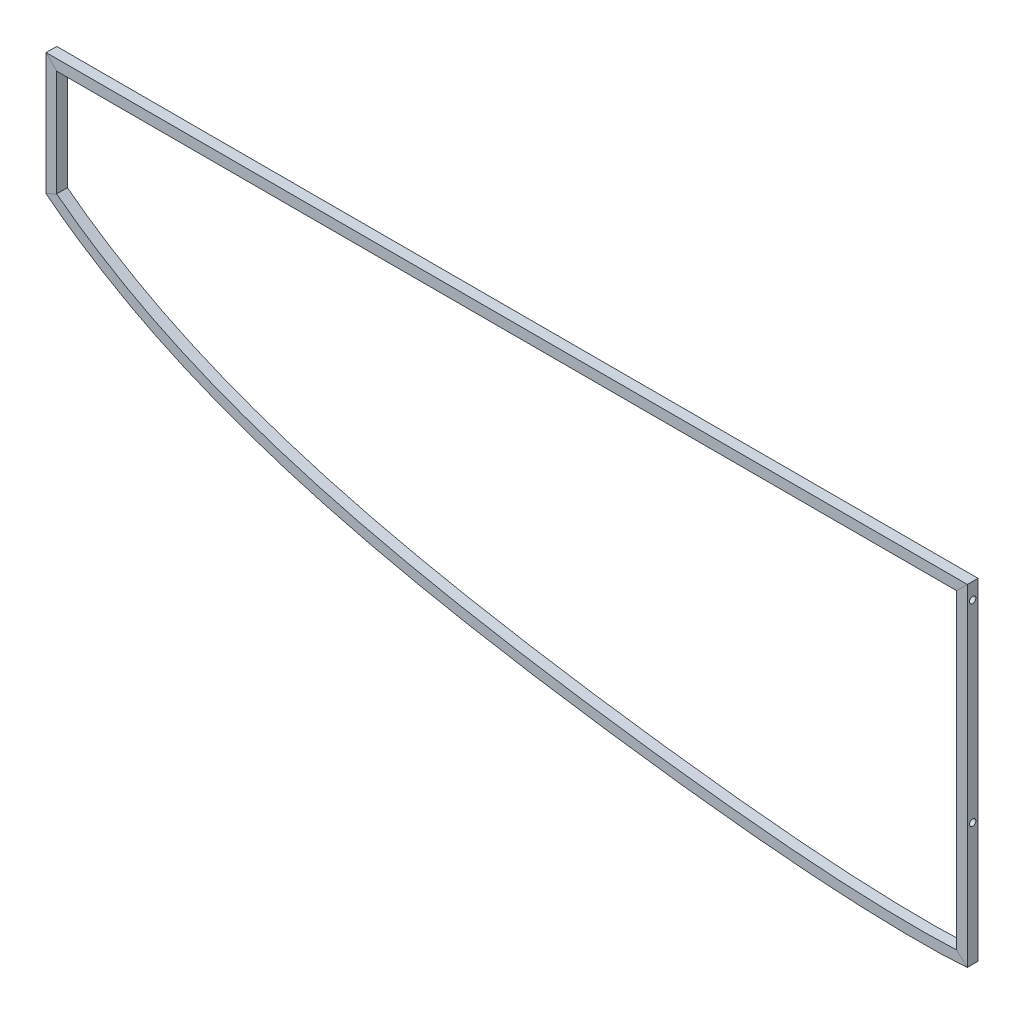
ISO-10303-21;
HEADER;
FILE_DESCRIPTION(('STEP AP214'),'2;1');
FILE_NAME('part.step','',(''),(''),'','','');
FILE_SCHEMA(('AUTOMOTIVE_DESIGN { 1 0 10303 214 1 1 1 1 }'));
ENDSEC;
DATA;
#1=APPLICATION_CONTEXT('core data for automotive mechanical design processes');
#2=APPLICATION_PROTOCOL_DEFINITION('international standard','automotive_design',2000,#1);
#3=PRODUCT_CONTEXT('',#1,'mechanical');
#4=PRODUCT('Part','Part','',(#3));
#5=PRODUCT_RELATED_PRODUCT_CATEGORY('part','',(#4));
#6=PRODUCT_DEFINITION_FORMATION('','',#4);
#7=PRODUCT_DEFINITION_CONTEXT('part definition',#1,'design');
#8=PRODUCT_DEFINITION('design','',#6,#7);
#9=PRODUCT_DEFINITION_SHAPE('','',#8);
#10=(LENGTH_UNIT() NAMED_UNIT(*) SI_UNIT(.MILLI.,.METRE.));
#11=(NAMED_UNIT(*) PLANE_ANGLE_UNIT() SI_UNIT($,.RADIAN.));
#12=(NAMED_UNIT(*) SI_UNIT($,.STERADIAN.) SOLID_ANGLE_UNIT());
#13=UNCERTAINTY_MEASURE_WITH_UNIT(LENGTH_MEASURE(1.E-05),#10,'distance_accuracy_value','');
#14=(GEOMETRIC_REPRESENTATION_CONTEXT(3) GLOBAL_UNCERTAINTY_ASSIGNED_CONTEXT((#13)) GLOBAL_UNIT_ASSIGNED_CONTEXT((#10,
#11,#12)) REPRESENTATION_CONTEXT('',''));
#15=CARTESIAN_POINT('',(0.,0.,0.));
#16=DIRECTION('',(0.,0.,1.));
#17=DIRECTION('',(1.,0.,0.));
#18=AXIS2_PLACEMENT_3D('',#15,#16,#17);
#19=CARTESIAN_POINT('',(43.1608813126704,-14.9890255154885,0.256277747607866));
#20=CARTESIAN_POINT('',(42.1977065370625,-15.0623980776926,0.256277747607866));
#21=CARTESIAN_POINT('',(40.0595586433162,-15.0983926124649,0.256277747607871));
#22=CARTESIAN_POINT('',(34.0554065649618,-14.7316159753437,0.256277747607871));
#23=CARTESIAN_POINT('',(30.1676829484615,-14.3224801673673,0.256277747607875));
#24=CARTESIAN_POINT('',(23.57051146709,-13.3722099659773,0.256277747607875));
#25=CARTESIAN_POINT('',(21.2474352072473,-13.0001626084811,0.256277747607878));
#26=CARTESIAN_POINT('',(16.5103526840526,-12.0800315265816,0.256277747607878));
#27=CARTESIAN_POINT('',(14.0956443202091,-11.529025125158,0.256277747607879));
#28=CARTESIAN_POINT('',(9.41683774067244,-10.1378840036944,0.256277747607879));
#29=CARTESIAN_POINT('',(7.14862853042051,-9.28644070187186,0.256277747607877));
#30=CARTESIAN_POINT('',(3.13241012325134,-7.31991184794454,0.256277747607877));
#31=CARTESIAN_POINT('',(1.38477876132513,-6.18783368503358,0.256277747607872));
#32=CARTESIAN_POINT('',(0.155893204895723,-5.21839039409237,0.256277747607872));
#33=CARTESIAN_POINT('',(43.1605337219629,-14.9844626290768,-0.251701640997907));
#34=CARTESIAN_POINT('',(42.1976896859935,-15.0578099963023,-0.251701640997907));
#35=CARTESIAN_POINT('',(40.0596671625024,-15.0938146047226,-0.251701640997902));
#36=CARTESIAN_POINT('',(34.0558560873831,-14.7270587985566,-0.251701640997902));
#37=CARTESIAN_POINT('',(30.1682343404047,-14.3179362553215,-0.251701640997897));
#38=CARTESIAN_POINT('',(23.5712143987289,-13.3676878820136,-0.251701640997897));
#39=CARTESIAN_POINT('',(21.2482096471728,-12.9956514019503,-0.251701640997895));
#40=CARTESIAN_POINT('',(16.5113233536712,-12.0755584357273,-0.251701640997895));
#41=CARTESIAN_POINT('',(14.0967511977093,-11.5245801343141,-0.251701640997894));
#42=CARTESIAN_POINT('',(9.41833921857712,-10.1335563387885,-0.251701640997894));
#43=CARTESIAN_POINT('',(7.15034669490692,-9.28218676425492,-0.251701640997896));
#44=CARTESIAN_POINT('',(3.13471672735123,-7.31594603832389,-0.251701640997896));
#45=CARTESIAN_POINT('',(1.38733208165102,-6.18401932551314,-0.2517016409979));
#46=CARTESIAN_POINT('',(0.15872744913245,-5.21479764983312,-0.2517016409979));
#47=B_SPLINE_SURFACE_WITH_KNOTS('',1,3,((#19,#20,#21,#22,#23,#24,#25,#26,#27,#28,#29,#30,#31,
#32),(#33,#34,#35,#36,#37,#38,#39,#40,#41,#42,#43,#44,#45,#46)),.UNSPECIFIED.,.F.,.F.,.F.,(2,2),
(4,2,2,2,2,2,4),(0.,1.),(0.,0.25,0.5,0.625,0.75,0.875,1.),.UNSPECIFIED.);
#48=CARTESIAN_POINT('',(0.251701641165775,-5.29348092747873,0.25627774760636));
#49=CARTESIAN_POINT('',(0.252082983291486,-5.29329455652352,0.213946131829942));
#50=CARTESIAN_POINT('',(0.252464325459027,-5.29310818227002,0.171614516068421));
#51=CARTESIAN_POINT('',(0.25341768094049,-5.29264223832548,0.0657854767017709));
#52=CARTESIAN_POINT('',(0.253989694285719,-5.29236266447903,0.00228805311521854));
#53=CARTESIAN_POINT('',(0.255133720975575,-5.29180350165099,-0.124706793991254));
#54=CARTESIAN_POINT('',(0.255705734320203,-5.2915239126694,-0.188204217511175));
#55=CARTESIAN_POINT('',(0.25627774760788,-5.29124431603238,-0.2517016409979));
#56=B_SPLINE_CURVE_WITH_KNOTS('',3,(#48,#49,#50,#51,#52,#53,#54,#55),.UNSPECIFIED.,.F.,.F.,(4,2,
2,4),(0.,0.127001230906354,0.317503077265896,0.508004923625448),.UNSPECIFIED.);
#57=CARTESIAN_POINT('',(0.251701887830832,-5.2934834955976,0.25627774760762));
#58=VERTEX_POINT('',#57);
#59=CARTESIAN_POINT('',(0.256278012579946,-5.29124707359022,-0.2517016409979));
#60=VERTEX_POINT('',#59);
#61=EDGE_CURVE('E350',#58,#60,#56,.T.);
#62=CARTESIAN_POINT('',(43.5210850329942,-14.9615859838674,0.256277747607864));
#63=CARTESIAN_POINT('',(43.4019951838441,-14.970657988117,0.256277747607874));
#64=CARTESIAN_POINT('',(43.2796471661761,-14.9799807855851,0.256277747607865));
#65=CARTESIAN_POINT('',(42.1901575661681,-15.0629519332152,0.256277747607865));
#66=CARTESIAN_POINT('',(40.0595586433162,-15.0983926124649,0.25627774760787));
#67=CARTESIAN_POINT('',(34.0554065649618,-14.7316159753437,0.25627774760787));
#68=CARTESIAN_POINT('',(30.1676829484615,-14.3224801673673,0.256277747607875));
#69=CARTESIAN_POINT('',(23.57051146709,-13.3722099659773,0.256277747607875));
#70=CARTESIAN_POINT('',(21.2474352072473,-13.0001626084811,0.256277747607878));
#71=CARTESIAN_POINT('',(16.5103526840526,-12.0800315265816,0.256277747607878));
#72=CARTESIAN_POINT('',(14.0956443202112,-11.529025125158,0.256277747607879));
#73=CARTESIAN_POINT('',(9.41683774067031,-10.1378840036944,0.256277747607879));
#74=CARTESIAN_POINT('',(7.14862853042051,-9.28644070187186,0.256277747607876));
#75=CARTESIAN_POINT('',(3.13241012325134,-7.31991184794454,0.256277747607876));
#76=CARTESIAN_POINT('',(1.39216153825419,-6.19363196719314,0.256277747607872));
#77=CARTESIAN_POINT('',(0.0943560904382608,-5.1698462789612,0.256277747607872));
#78=CARTESIAN_POINT('',(0.0317135701671623,-5.12042755881915,0.256277747607872));
#79=CARTESIAN_POINT('',(-0.0299230622114602,-5.07180364977235,0.256277747607872));
#80=B_SPLINE_CURVE_WITH_KNOTS('',3,(#62,#63,#64,#65,#66,#67,#68,#69,#70,#71,#72,#73,#74,#75,#76,
#77,#78,#79),.UNSPECIFIED.,.F.,.F.,(4,2,2,2,2,2,2,2,4),(-0.0305869342162508,0.,0.25,0.5,0.625,
0.75,0.875,1.,1.00622206288038),.UNSPECIFIED.);
#81=CARTESIAN_POINT('',(42.9282983590021,-15.0046017950914,0.256277747607866));
#82=VERTEX_POINT('',#81);
#83=EDGE_CURVE('E51',#82,#58,#80,.T.);
#84=CARTESIAN_POINT('',(42.9282983590021,-15.0046017950914,0.256277747607867));
#85=CARTESIAN_POINT('',(42.9279170167809,-15.0042422349058,0.213946131483439));
#86=CARTESIAN_POINT('',(42.9275356745607,-15.0038826627125,0.171614515460995));
#87=CARTESIAN_POINT('',(42.9265823190123,-15.002983702246,0.0657854756595083));
#88=CARTESIAN_POINT('',(42.9260103056854,-15.0024442989814,0.00228805200780034));
#89=CARTESIAN_POINT('',(42.9248662790357,-15.0013654385809,-0.124706794838045));
#90=CARTESIAN_POINT('',(42.9242942657129,-15.000825981445,-0.188204218032183));
#91=CARTESIAN_POINT('',(42.9237222523921,-15.0002864974226,-0.251701640997907));
#92=B_SPLINE_CURVE_WITH_KNOTS('',3,(#84,#85,#86,#87,#88,#89,#90,#91),.UNSPECIFIED.,.F.,.F.,(4,2,
2,4),(0.,0.127004582051609,0.317511455129154,0.508018328206837),.UNSPECIFIED.);
#93=CARTESIAN_POINT('',(42.9237219356784,-15.0002973744549,-0.251701640997906));
#94=VERTEX_POINT('',#93);
#95=EDGE_CURVE('E319',#82,#94,#92,.T.);
#96=CARTESIAN_POINT('',(43.5207374422867,-14.9570230974557,-0.251701640997908));
#97=CARTESIAN_POINT('',(43.4016657013447,-14.9660937222616,-0.251701640997898));
#98=CARTESIAN_POINT('',(43.2792754649397,-14.9754197347965,-0.251701640997907));
#99=CARTESIAN_POINT('',(42.1900070410499,-15.058374043476,-0.251701640997907));
#100=CARTESIAN_POINT('',(40.0596671625024,-15.0938146047226,-0.251701640997902));
#101=CARTESIAN_POINT('',(34.0558560873831,-14.7270587985566,-0.251701640997902));
#102=CARTESIAN_POINT('',(30.1682343404047,-14.3179362553176,-0.251701640997897));
#103=CARTESIAN_POINT('',(23.5712143987289,-13.3676878820156,-0.251701640997897));
#104=CARTESIAN_POINT('',(21.2482096471728,-12.9956514019503,-0.251701640997895));
#105=CARTESIAN_POINT('',(16.5113233536712,-12.0755584357273,-0.251701640997895));
#106=CARTESIAN_POINT('',(14.0967511977093,-11.5245801343119,-0.251701640997894));
#107=CARTESIAN_POINT('',(9.41833921857712,-10.1335563387907,-0.251701640997894));
#108=CARTESIAN_POINT('',(7.15034669490692,-9.28218676425492,-0.251701640997896));
#109=CARTESIAN_POINT('',(3.13471672735123,-7.31594603832389,-0.251701640997896));
#110=CARTESIAN_POINT('',(1.39484809642748,-6.18992272256034,-0.2517016409979));
#111=CARTESIAN_POINT('',(0.0971976859707738,-5.16625933368314,-0.2517016409979));
#112=CARTESIAN_POINT('',(0.0345422933091377,-5.11683045907844,-0.2517016409979));
#113=CARTESIAN_POINT('',(-0.0270888179747329,-5.0682109055131,-0.2517016409979));
#114=B_SPLINE_CURVE_WITH_KNOTS('',3,(#96,#97,#98,#99,#100,#101,#102,#103,#104,#105,#106,#107,
#108,#109,#110,#111,#112,#113),.UNSPECIFIED.,.F.,.F.,(4,2,2,2,2,2,2,2,4),(-0.0305869342162508,
0.,0.25,0.5,0.625,0.75,0.875,1.,1.00622206288038),.UNSPECIFIED.);
#115=EDGE_CURVE('E141',#94,#60,#114,.T.);
#116=ORIENTED_EDGE('',*,*,#61,.F.);
#117=ORIENTED_EDGE('',*,*,#83,.F.);
#118=ORIENTED_EDGE('',*,*,#95,.T.);
#119=ORIENTED_EDGE('',*,*,#115,.T.);
#120=EDGE_LOOP('',(#116,#117,#118,#119));
#121=FACE_BOUND('',#120,.T.);
#122=ADVANCED_FACE('F45',(#121),#47,.T.);
#123=CARTESIAN_POINT('',(43.5207374422867,-14.9570230974557,-0.251701640997908));
#124=CARTESIAN_POINT('',(43.4016657013447,-14.9660937222616,-0.251701640997898));
#125=CARTESIAN_POINT('',(43.2792754649397,-14.9754197347965,-0.251701640997907));
#126=CARTESIAN_POINT('',(42.1900070410499,-15.058374043476,-0.251701640997907));
#127=CARTESIAN_POINT('',(40.0596671625024,-15.0938146047226,-0.251701640997902));
#128=CARTESIAN_POINT('',(34.0558560873831,-14.7270587985566,-0.251701640997902));
#129=CARTESIAN_POINT('',(30.1682343404047,-14.3179362553176,-0.251701640997897));
#130=CARTESIAN_POINT('',(23.5712143987289,-13.3676878820156,-0.251701640997897));
#131=CARTESIAN_POINT('',(21.2482096471728,-12.9956514019503,-0.251701640997895));
#132=CARTESIAN_POINT('',(16.5113233536712,-12.0755584357273,-0.251701640997895));
#133=CARTESIAN_POINT('',(14.0967511977093,-11.5245801343119,-0.251701640997894));
#134=CARTESIAN_POINT('',(9.41833921857712,-10.1335563387907,-0.251701640997894));
#135=CARTESIAN_POINT('',(7.15034669490692,-9.28218676425492,-0.251701640997896));
#136=CARTESIAN_POINT('',(3.13471672735123,-7.31594603832389,-0.251701640997896));
#137=CARTESIAN_POINT('',(1.39484809642748,-6.18992272256034,-0.2517016409979));
#138=CARTESIAN_POINT('',(0.0971976859707738,-5.16625933368314,-0.2517016409979));
#139=CARTESIAN_POINT('',(0.0345422933091377,-5.11683045907844,-0.2517016409979));
#140=CARTESIAN_POINT('',(-0.0270888179747329,-5.0682109055131,-0.2517016409979));
#141=CARTESIAN_POINT('',(43.5593224076534,-15.4635349528905,-0.256277747607876));
#142=CARTESIAN_POINT('',(43.4382405307807,-15.4727587054552,-0.256277747607866));
#143=CARTESIAN_POINT('',(43.3205368652361,-15.4817278233993,-0.256277747607875));
#144=CARTESIAN_POINT('',(42.2067163673716,-15.566551371744,-0.256277747607875));
#145=CARTESIAN_POINT('',(40.0476207851262,-15.6020050322157,-0.25627774760787));
#146=CARTESIAN_POINT('',(34.0059559983117,-15.232936846211,-0.25627774760787));
#147=CARTESIAN_POINT('',(30.1070260329861,-14.8223418258869,-0.256277747607866));
#148=CARTESIAN_POINT('',(23.4931841394771,-13.8696703840638,-0.256277747607866));
#149=CARTESIAN_POINT('',(21.1622414751336,-13.496426434318,-0.256277747607863));
#150=CARTESIAN_POINT('',(16.4035723327812,-12.5721023650183,-0.256277747607863));
#151=CARTESIAN_POINT('',(13.9738801626651,-12.0180047689144,-0.256277747607862));
#152=CARTESIAN_POINT('',(9.25166481756314,-10.6139569849501,-0.256277747607862));
#153=CARTESIAN_POINT('',(6.95961858912296,-9.75440317312925,-0.256277747607866));
#154=CARTESIAN_POINT('',(2.87866776695075,-7.75617825272913,-0.256277747607866));
#155=CARTESIAN_POINT('',(1.09662161381993,-6.60167445420979,-0.256277747607872));
#156=CARTESIAN_POINT('',(-0.218239012580985,-5.56443499360627,-0.256277747607872));
#157=CARTESIAN_POINT('',(-0.279465481129904,-5.51613333437817,-0.256277747607872));
#158=CARTESIAN_POINT('',(-0.341709472002886,-5.46703029233775,-0.256277747607872));
#159=B_SPLINE_SURFACE_WITH_KNOTS('',1,3,((#123,#124,#125,#126,#127,#128,#129,#130,#131,#132,
#133,#134,#135,#136,#137,#138,#139,#140),(#141,#142,#143,#144,#145,#146,#147,#148,#149,#150,
#151,#152,#153,#154,#155,#156,#157,#158)),.UNSPECIFIED.,.F.,.F.,.F.,(2,2),(4,2,2,2,2,2,2,2,4),
(0.,1.),(-0.0305869342162508,0.,0.25,0.5,0.625,0.75,0.875,1.,1.00622206288038),.UNSPECIFIED.);
#160=CARTESIAN_POINT('',(0.256277747607617,-5.29124814293782,-0.2517016409979));
#161=CARTESIAN_POINT('',(0.171724683628329,-5.33260565850156,-0.252463332994955));
#162=CARTESIAN_POINT('',(0.0870728279656792,-5.37375980992567,-0.253225914951888));
#163=CARTESIAN_POINT('',(-0.0399546937946219,-5.435389055482,-0.254370235951941));
#164=CARTESIAN_POINT('',(-0.0823055706563701,-5.45591517900893,-0.254751751682485));
#165=CARTESIAN_POINT('',(-0.167007415691318,-5.49696723769861,-0.255514783966147));
#166=CARTESIAN_POINT('',(-0.209358383864517,-5.51749317286136,-0.255896300519266));
#167=CARTESIAN_POINT('',(-0.25170118019209,-5.53803592963145,-0.256277743456727));
#168=B_SPLINE_CURVE_WITH_KNOTS('',3,(#160,#161,#162,#163,#164,#165,#166,#167),.UNSPECIFIED.,.F.,
.F.,(4,2,2,4),(0.,0.282385705495381,0.423579090669607,0.564772475828346),.UNSPECIFIED.);
#169=CARTESIAN_POINT('',(-0.251701640997895,-5.53803615304195,-0.256277747607872));
#170=VERTEX_POINT('',#169);
#171=EDGE_CURVE('E115',#60,#170,#168,.T.);
#172=CARTESIAN_POINT('',(42.9237222523921,-15.0003082248229,-0.251701640997906));
#173=CARTESIAN_POINT('',(42.9546055336974,-15.0294195494995,-0.251979851474332));
#174=CARTESIAN_POINT('',(42.9855207578275,-15.0584972294976,-0.252258349706079));
#175=CARTESIAN_POINT('',(43.0474364587972,-15.1165610401393,-0.252816114164291));
#176=CARTESIAN_POINT('',(43.078436934795,-15.1455471716809,-0.253095380383173));
#177=CARTESIAN_POINT('',(43.163078630473,-15.2243953527835,-0.253857870814397));
#178=CARTESIAN_POINT('',(43.2168258849686,-15.2741434476555,-0.254342050236007));
#179=CARTESIAN_POINT('',(43.2974127027365,-15.3488021981457,-0.255068012504822));
#180=CARTESIAN_POINT('',(43.3242693414024,-15.3736945899592,-0.255309949174847));
#181=CARTESIAN_POINT('',(43.3779826036905,-15.4234792004736,-0.255793822379377));
#182=CARTESIAN_POINT('',(43.4048392273124,-15.4483714191748,-0.256035758913879));
#183=CARTESIAN_POINT('',(43.4317016220663,-15.4732574643265,-0.256277747437331));
#184=B_SPLINE_CURVE_WITH_KNOTS('',3,(#172,#173,#174,#175,#176,#177,#178,#179,#180,#181,#182,
#183),.UNSPECIFIED.,.F.,.F.,(4,2,2,2,2,4),(0.,0.127326274143445,0.254651295497365,
0.474366098674766,0.584223855594922,0.694081226413812),.UNSPECIFIED.);
#185=CARTESIAN_POINT('',(43.4317016409974,-15.4732574818702,-0.256277747607871));
#186=VERTEX_POINT('',#185);
#187=EDGE_CURVE('E338',#94,#186,#184,.T.);
#188=CARTESIAN_POINT('',(43.5593224076534,-15.4635349528905,-0.256277747607876));
#189=CARTESIAN_POINT('',(43.4382405307807,-15.4727587054552,-0.256277747607866));
#190=CARTESIAN_POINT('',(43.3205368652361,-15.4817278233993,-0.256277747607875));
#191=CARTESIAN_POINT('',(42.2067163673716,-15.566551371744,-0.256277747607875));
#192=CARTESIAN_POINT('',(40.0476207851262,-15.6020050322157,-0.25627774760787));
#193=CARTESIAN_POINT('',(34.0059559983117,-15.232936846211,-0.25627774760787));
#194=CARTESIAN_POINT('',(30.1070260329861,-14.8223418258869,-0.256277747607866));
#195=CARTESIAN_POINT('',(23.4931841394771,-13.8696703840638,-0.256277747607866));
#196=CARTESIAN_POINT('',(21.1622414751336,-13.496426434318,-0.256277747607863));
#197=CARTESIAN_POINT('',(16.4035723327812,-12.5721023650183,-0.256277747607863));
#198=CARTESIAN_POINT('',(13.9738801626651,-12.0180047689144,-0.256277747607862));
#199=CARTESIAN_POINT('',(9.25166481756314,-10.6139569849501,-0.256277747607862));
#200=CARTESIAN_POINT('',(6.95961858912296,-9.75440317312925,-0.256277747607866));
#201=CARTESIAN_POINT('',(2.87866776695075,-7.75617825272913,-0.256277747607866));
#202=CARTESIAN_POINT('',(1.09662161381993,-6.60167445420979,-0.256277747607872));
#203=CARTESIAN_POINT('',(-0.218239012580985,-5.56443499360627,-0.256277747607872));
#204=CARTESIAN_POINT('',(-0.279465481129904,-5.51613333437817,-0.256277747607872));
#205=CARTESIAN_POINT('',(-0.341709472002886,-5.46703029233775,-0.256277747607872));
#206=B_SPLINE_CURVE_WITH_KNOTS('',3,(#188,#189,#190,#191,#192,#193,#194,#195,#196,#197,#198,
#199,#200,#201,#202,#203,#204,#205),.UNSPECIFIED.,.F.,.F.,(4,2,2,2,2,2,2,2,4),
(-0.0305869342162508,0.,0.25,0.5,0.625,0.75,0.875,1.,1.00622206288038),.UNSPECIFIED.);
#207=EDGE_CURVE('E120',#186,#170,#206,.T.);
#208=ORIENTED_EDGE('',*,*,#171,.F.);
#209=ORIENTED_EDGE('',*,*,#115,.F.);
#210=ORIENTED_EDGE('',*,*,#187,.T.);
#211=ORIENTED_EDGE('',*,*,#207,.T.);
#212=EDGE_LOOP('',(#208,#209,#210,#211));
#213=FACE_BOUND('',#212,.T.);
#214=ADVANCED_FACE('F565',(#213),#159,.T.);
#215=CARTESIAN_POINT('',(43.5593224076534,-15.4635349528905,-0.256277747607876));
#216=CARTESIAN_POINT('',(43.4382405307807,-15.4727587054552,-0.256277747607866));
#217=CARTESIAN_POINT('',(43.3205368652361,-15.4817278233993,-0.256277747607875));
#218=CARTESIAN_POINT('',(42.2067163673716,-15.566551371744,-0.256277747607875));
#219=CARTESIAN_POINT('',(40.0476207851262,-15.6020050322157,-0.25627774760787));
#220=CARTESIAN_POINT('',(34.0059559983117,-15.232936846211,-0.25627774760787));
#221=CARTESIAN_POINT('',(30.1070260329861,-14.8223418258869,-0.256277747607866));
#222=CARTESIAN_POINT('',(23.4931841394771,-13.8696703840638,-0.256277747607866));
#223=CARTESIAN_POINT('',(21.1622414751336,-13.496426434318,-0.256277747607863));
#224=CARTESIAN_POINT('',(16.4035723327812,-12.5721023650183,-0.256277747607863));
#225=CARTESIAN_POINT('',(13.9738801626651,-12.0180047689144,-0.256277747607862));
#226=CARTESIAN_POINT('',(9.25166481756314,-10.6139569849501,-0.256277747607862));
#227=CARTESIAN_POINT('',(6.95961858912296,-9.75440317312925,-0.256277747607866));
#228=CARTESIAN_POINT('',(2.87866776695075,-7.75617825272913,-0.256277747607866));
#229=CARTESIAN_POINT('',(1.09662161381993,-6.60167445420979,-0.256277747607872));
#230=CARTESIAN_POINT('',(-0.218239012580985,-5.56443499360627,-0.256277747607872));
#231=CARTESIAN_POINT('',(-0.279465481129904,-5.51613333437817,-0.256277747607872));
#232=CARTESIAN_POINT('',(-0.341709472002886,-5.46703029233775,-0.256277747607872));
#233=CARTESIAN_POINT('',(43.5596699983609,-15.4680978393021,0.251701640997897));
#234=CARTESIAN_POINT('',(43.4385700132805,-15.4773229713106,0.251701640997906));
#235=CARTESIAN_POINT('',(43.320908566472,-15.4862888741878,0.251701640997898));
#236=CARTESIAN_POINT('',(42.2068668924932,-15.5711292614833,0.251701640997898));
#237=CARTESIAN_POINT('',(40.0475122659295,-15.606583039958,0.251701640997903));
#238=CARTESIAN_POINT('',(34.0055064759009,-15.2374940229981,0.251701640997903));
#239=CARTESIAN_POINT('',(30.106474641043,-14.8268857379365,0.251701640997907));
#240=CARTESIAN_POINT('',(23.4924812078383,-13.8741924680254,0.251701640997907));
#241=CARTESIAN_POINT('',(21.1614670352082,-13.5009376408509,0.251701640997909));
#242=CARTESIAN_POINT('',(16.4026016631627,-12.5765754558705,0.251701640997909));
#243=CARTESIAN_POINT('',(13.9727732851649,-12.0224497597584,0.25170164099791));
#244=CARTESIAN_POINT('',(9.25016333965845,-10.618284649856,0.25170164099791));
#245=CARTESIAN_POINT('',(6.95790042463557,-9.7586571107462,0.251701640997906));
#246=CARTESIAN_POINT('',(2.87636116285183,-7.76014406234978,0.251701640997906));
#247=CARTESIAN_POINT('',(1.09393505564663,-6.60538369884259,0.2517016409979));
#248=CARTESIAN_POINT('',(-0.221080608113498,-5.56802193888432,0.2517016409979));
#249=CARTESIAN_POINT('',(-0.28229420427188,-5.51973043411888,0.2517016409979));
#250=CARTESIAN_POINT('',(-0.344543716239613,-5.470623036597,0.2517016409979));
#251=B_SPLINE_SURFACE_WITH_KNOTS('',1,3,((#215,#216,#217,#218,#219,#220,#221,#222,#223,#224,
#225,#226,#227,#228,#229,#230,#231,#232),(#233,#234,#235,#236,#237,#238,#239,#240,#241,#242,
#243,#244,#245,#246,#247,#248,#249,#250)),.UNSPECIFIED.,.F.,.F.,.F.,(2,2),(4,2,2,2,2,2,2,2,4),
(0.,1.),(-0.0305869342162508,0.,0.25,0.5,0.625,0.75,0.875,1.,1.00622206288038),.UNSPECIFIED.);
#252=CARTESIAN_POINT('',(43.5596699983609,-15.4680978393021,0.251701640997897));
#253=CARTESIAN_POINT('',(43.4385700132805,-15.4773229713106,0.251701640997906));
#254=CARTESIAN_POINT('',(43.320908566472,-15.4862888741878,0.251701640997898));
#255=CARTESIAN_POINT('',(42.2068668924932,-15.5711292614833,0.251701640997898));
#256=CARTESIAN_POINT('',(40.0475122659295,-15.606583039958,0.251701640997903));
#257=CARTESIAN_POINT('',(34.0055064759009,-15.2374940229981,0.251701640997903));
#258=CARTESIAN_POINT('',(30.106474641043,-14.8268857379365,0.251701640997907));
#259=CARTESIAN_POINT('',(23.4924812078383,-13.8741924680254,0.251701640997907));
#260=CARTESIAN_POINT('',(21.1614670352082,-13.5009376408509,0.251701640997909));
#261=CARTESIAN_POINT('',(16.4026016631627,-12.5765754558705,0.251701640997909));
#262=CARTESIAN_POINT('',(13.9727732851649,-12.0224497597584,0.25170164099791));
#263=CARTESIAN_POINT('',(9.25016333965845,-10.618284649856,0.25170164099791));
#264=CARTESIAN_POINT('',(6.95790042463557,-9.7586571107462,0.251701640997906));
#265=CARTESIAN_POINT('',(2.87636116285183,-7.76014406234978,0.251701640997906));
#266=CARTESIAN_POINT('',(1.09393505564663,-6.60538369884259,0.2517016409979));
#267=CARTESIAN_POINT('',(-0.221080608113498,-5.56802193888432,0.2517016409979));
#268=CARTESIAN_POINT('',(-0.28229420427188,-5.51973043411888,0.2517016409979));
#269=CARTESIAN_POINT('',(-0.344543716239613,-5.470623036597,0.2517016409979));
#270=B_SPLINE_CURVE_WITH_KNOTS('',3,(#252,#253,#254,#255,#256,#257,#258,#259,#260,#261,#262,
#263,#264,#265,#266,#267,#268,#269),.UNSPECIFIED.,.F.,.F.,(4,2,2,2,2,2,2,2,4),
(-0.0305869342162508,0.,0.25,0.5,0.625,0.75,0.875,1.,1.00622206288038),.UNSPECIFIED.);
#271=CARTESIAN_POINT('',(43.4362777476076,-15.4774982175394,0.251701640997899));
#272=VERTEX_POINT('',#271);
#273=CARTESIAN_POINT('',(-0.256277744874672,-5.54025477121923,0.251701640987572));
#274=VERTEX_POINT('',#273);
#275=EDGE_CURVE('E107',#272,#274,#270,.T.);
#276=CARTESIAN_POINT('',(-0.256277743021098,-5.54025477417745,0.251701640956587));
#277=CARTESIAN_POINT('',(-0.255896403326106,-5.54006988571871,0.209370025238294));
#278=CARTESIAN_POINT('',(-0.255515062484538,-5.53988499906593,0.167038409522443));
#279=CARTESIAN_POINT('',(-0.254561708660756,-5.53942278513965,0.061209370236491));
#280=CARTESIAN_POINT('',(-0.253989694818609,-5.53914545921897,-0.00228805333177167));
#281=CARTESIAN_POINT('',(-0.252845667134313,-5.53859080736281,-0.129282900468232));
#282=CARTESIAN_POINT('',(-0.252273653292164,-5.53831348142733,-0.192780324036431));
#283=CARTESIAN_POINT('',(-0.251701640997891,-5.53803615304195,-0.256277747607872));
#284=B_SPLINE_CURVE_WITH_KNOTS('',3,(#276,#277,#278,#279,#280,#281,#282,#283),.UNSPECIFIED.,.F.,
.F.,(4,2,2,4),(0.,0.127001211164449,0.317503027911123,0.508004844657796),.UNSPECIFIED.);
#285=EDGE_CURVE('E98',#274,#170,#284,.T.);
#286=CARTESIAN_POINT('',(43.4362777476079,-15.4774982175394,0.2517016409979));
#287=CARTESIAN_POINT('',(43.4358964053904,-15.4771448229049,0.209370025280714));
#288=CARTESIAN_POINT('',(43.4355150631729,-15.4767914282695,0.167038409563535));
#289=CARTESIAN_POINT('',(43.4347523787379,-15.4760846389966,0.0823751781291953));
#290=CARTESIAN_POINT('',(43.4343710365204,-15.4757312443591,0.0400435624120344));
#291=CARTESIAN_POINT('',(43.4332270098679,-15.4746710604426,-0.0869512847394154));
#292=CARTESIAN_POINT('',(43.4324643254329,-15.4739642711598,-0.171614516173672));
#293=CARTESIAN_POINT('',(43.4317016409979,-15.4732574818702,-0.256277747607871));
#294=B_SPLINE_CURVE_WITH_KNOTS('',3,(#286,#287,#288,#289,#290,#291,#292,#293),.UNSPECIFIED.,.F.,
.F.,(4,2,2,4),(0.,0.127004425080147,0.254008850160293,0.508017700320585),.UNSPECIFIED.);
#295=EDGE_CURVE('E119',#272,#186,#294,.T.);
#296=ORIENTED_EDGE('',*,*,#275,.T.);
#297=ORIENTED_EDGE('',*,*,#285,.T.);
#298=ORIENTED_EDGE('',*,*,#207,.F.);
#299=ORIENTED_EDGE('',*,*,#295,.F.);
#300=EDGE_LOOP('',(#296,#297,#298,#299));
#301=FACE_BOUND('',#300,.T.);
#302=ADVANCED_FACE('F117',(#301),#251,.T.);
#303=CARTESIAN_POINT('',(43.5596699983609,-15.4680978393021,0.251701640997896));
#304=CARTESIAN_POINT('',(43.4385700132805,-15.4773229713106,0.251701640997906));
#305=CARTESIAN_POINT('',(43.320908566472,-15.4862888741878,0.251701640997897));
#306=CARTESIAN_POINT('',(42.2068668924932,-15.5711292614833,0.251701640997897));
#307=CARTESIAN_POINT('',(40.0475122659295,-15.606583039958,0.251701640997902));
#308=CARTESIAN_POINT('',(34.0055064759009,-15.2374940229981,0.251701640997902));
#309=CARTESIAN_POINT('',(30.106474641043,-14.8268857379365,0.251701640997907));
#310=CARTESIAN_POINT('',(23.4924812078383,-13.8741924680254,0.251701640997907));
#311=CARTESIAN_POINT('',(21.1614670352082,-13.5009376408509,0.251701640997909));
#312=CARTESIAN_POINT('',(16.4026016631627,-12.5765754558705,0.251701640997909));
#313=CARTESIAN_POINT('',(13.9727732851649,-12.0224497597584,0.25170164099791));
#314=CARTESIAN_POINT('',(9.25016333965845,-10.618284649856,0.25170164099791));
#315=CARTESIAN_POINT('',(6.95790042463557,-9.7586571107462,0.251701640997906));
#316=CARTESIAN_POINT('',(2.87636116285183,-7.76014406234978,0.251701640997906));
#317=CARTESIAN_POINT('',(1.09393505564663,-6.60538369884259,0.2517016409979));
#318=CARTESIAN_POINT('',(-0.221080608113498,-5.56802193888432,0.2517016409979));
#319=CARTESIAN_POINT('',(-0.28229420427188,-5.51973043411888,0.2517016409979));
#320=CARTESIAN_POINT('',(-0.344543716239613,-5.470623036597,0.2517016409979));
#321=CARTESIAN_POINT('',(43.5210850329942,-14.9615859838674,0.256277747607864));
#322=CARTESIAN_POINT('',(43.4019951838441,-14.970657988117,0.256277747607874));
#323=CARTESIAN_POINT('',(43.2796471661761,-14.9799807855851,0.256277747607865));
#324=CARTESIAN_POINT('',(42.1901575661681,-15.0629519332152,0.256277747607865));
#325=CARTESIAN_POINT('',(40.0595586433162,-15.0983926124649,0.25627774760787));
#326=CARTESIAN_POINT('',(34.0554065649618,-14.7316159753437,0.25627774760787));
#327=CARTESIAN_POINT('',(30.1676829484615,-14.3224801673673,0.256277747607875));
#328=CARTESIAN_POINT('',(23.57051146709,-13.3722099659773,0.256277747607875));
#329=CARTESIAN_POINT('',(21.2474352072473,-13.0001626084811,0.256277747607878));
#330=CARTESIAN_POINT('',(16.5103526840526,-12.0800315265816,0.256277747607878));
#331=CARTESIAN_POINT('',(14.0956443202112,-11.529025125158,0.256277747607879));
#332=CARTESIAN_POINT('',(9.41683774067031,-10.1378840036944,0.256277747607879));
#333=CARTESIAN_POINT('',(7.14862853042051,-9.28644070187186,0.256277747607876));
#334=CARTESIAN_POINT('',(3.13241012325134,-7.31991184794454,0.256277747607876));
#335=CARTESIAN_POINT('',(1.39216153825419,-6.19363196719314,0.256277747607872));
#336=CARTESIAN_POINT('',(0.0943560904382608,-5.1698462789612,0.256277747607872));
#337=CARTESIAN_POINT('',(0.0317135701671623,-5.12042755881915,0.256277747607872));
#338=CARTESIAN_POINT('',(-0.0299230622114602,-5.07180364977235,0.256277747607872));
#339=B_SPLINE_SURFACE_WITH_KNOTS('',1,3,((#303,#304,#305,#306,#307,#308,#309,#310,#311,#312,
#313,#314,#315,#316,#317,#318,#319,#320),(#321,#322,#323,#324,#325,#326,#327,#328,#329,#330,
#331,#332,#333,#334,#335,#336,#337,#338)),.UNSPECIFIED.,.F.,.F.,.F.,(2,2),(4,2,2,2,2,2,2,2,4),
(0.,1.),(-0.0305869342162508,0.,0.25,0.5,0.625,0.75,0.875,1.,1.00622206288038),.UNSPECIFIED.);
#340=CARTESIAN_POINT('',(0.251701640997905,-5.29348449143897,0.256277747607872));
#341=CARTESIAN_POINT('',(0.16714475765283,-5.33483120324034,0.255516021204255));
#342=CARTESIAN_POINT('',(0.0824925083308823,-5.3759815885363,0.254753435701063));
#343=CARTESIAN_POINT('',(-0.0445338683467186,-5.4376087317597,0.25360912501643));
#344=CARTESIAN_POINT('',(-0.0868840705545177,-5.45813474386985,0.253227615363472));
#345=CARTESIAN_POINT('',(-0.171584558623634,-5.49918659553143,0.252464595303967));
#346=CARTESIAN_POINT('',(-0.213934844484951,-5.51971243508287,0.252083084897421));
#347=CARTESIAN_POINT('',(-0.256277238875035,-5.54025452029446,0.251701645580794));
#348=B_SPLINE_CURVE_WITH_KNOTS('',3,(#340,#341,#342,#343,#344,#345,#346,#347),.UNSPECIFIED.,.F.,
.F.,(4,2,2,4),(0.,0.282381822632507,0.423573241745105,0.564764660854301),.UNSPECIFIED.);
#349=EDGE_CURVE('E105',#58,#274,#348,.T.);
#350=CARTESIAN_POINT('',(42.9282983590021,-15.0046223955674,0.256277747607866));
#351=CARTESIAN_POINT('',(42.9591844831291,-15.0337307158714,0.255999511522025));
#352=CARTESIAN_POINT('',(42.9901041317082,-15.0628036853998,0.255720973432853));
#353=CARTESIAN_POINT('',(43.0520292164259,-15.1208574874813,0.255163124441622));
#354=CARTESIAN_POINT('',(43.0830346517313,-15.1498383209236,0.25488381354707));
#355=CARTESIAN_POINT('',(43.1676808841509,-15.2286694029484,0.254121282246838));
#356=CARTESIAN_POINT('',(43.2214256005462,-15.2784079379857,0.253637125689577));
#357=CARTESIAN_POINT('',(43.3020045880645,-15.3530566974601,0.252911233959167));
#358=CARTESIAN_POINT('',(43.3288579418088,-15.3779464797196,0.252669326881191));
#359=CARTESIAN_POINT('',(43.3825646341551,-15.4277258789662,0.252185512861651));
#360=CARTESIAN_POINT('',(43.4094179727569,-15.4526154959537,0.251943605920089));
#361=CARTESIAN_POINT('',(43.4362777476077,-15.4774982175394,0.251701640997904));
#362=B_SPLINE_CURVE_WITH_KNOTS('',3,(#350,#351,#352,#353,#354,#355,#356,#357,#358,#359,#360,
#361),.UNSPECIFIED.,.F.,.F.,(4,2,2,2,2,4),(0.,0.127326271992755,0.25465131143586,
0.474341080170523,0.5841862845158,0.694031118529972),.UNSPECIFIED.);
#363=EDGE_CURVE('E207',#82,#272,#362,.T.);
#364=ORIENTED_EDGE('',*,*,#83,.T.);
#365=ORIENTED_EDGE('',*,*,#349,.T.);
#366=ORIENTED_EDGE('',*,*,#275,.F.);
#367=ORIENTED_EDGE('',*,*,#363,.F.);
#368=EDGE_LOOP('',(#364,#365,#366,#367));
#369=FACE_BOUND('',#368,.T.);
#370=ADVANCED_FACE('F106',(#369),#339,.T.);
#371=CARTESIAN_POINT('',(-0.256277747607865,-5.65267935571853,0.2517016409979));
#372=DIRECTION('',(-0.00900808387789867,0.,0.999959426389315));
#373=DIRECTION('',(0.999959426389315,0.,0.00900808387789867));
#374=AXIS2_PLACEMENT_3D('',#371,#372,#373);
#375=PLANE('',#374);
#376=DIRECTION('',(0.,1.,0.));
#377=VECTOR('',#376,1.);
#378=CARTESIAN_POINT('',(0.251701640997907,-5.65267935571853,0.256277747607872));
#379=LINE('',#378,#377);
#380=CARTESIAN_POINT('',(0.251701640997904,-0.251701640997905,0.256277747607872));
#381=VERTEX_POINT('',#380);
#382=EDGE_CURVE('E138',#58,#381,#379,.T.);
#383=ORIENTED_EDGE('',*,*,#382,.T.);
#384=DIRECTION('',(-0.707092435812393,0.707092435812393,-0.0063698064172668));
#385=VECTOR('',#384,1.);
#386=CARTESIAN_POINT('',(-0.319089086350349,0.319089086350349,0.251135808232148));
#387=LINE('',#386,#385);
#388=CARTESIAN_POINT('',(-0.256277747607868,0.256277747607867,0.251701640997901));
#389=VERTEX_POINT('',#388);
#390=EDGE_CURVE('E137',#381,#389,#387,.T.);
#391=ORIENTED_EDGE('',*,*,#390,.T.);
#392=DIRECTION('',(0.,1.,0.));
#393=VECTOR('',#392,1.);
#394=CARTESIAN_POINT('',(-0.256277747607865,-5.65267935571853,0.2517016409979));
#395=LINE('',#394,#393);
#396=EDGE_CURVE('E128',#274,#389,#395,.T.);
#397=ORIENTED_EDGE('',*,*,#396,.F.);
#398=ORIENTED_EDGE('',*,*,#349,.F.);
#399=EDGE_LOOP('',(#383,#391,#397,#398));
#400=FACE_BOUND('',#399,.T.);
#401=ADVANCED_FACE('F135',(#400),#375,.T.);
#402=CARTESIAN_POINT('',(-0.251701640997893,-5.65267935571853,-0.256277747607872));
#403=DIRECTION('',(-0.999959426389316,0.,-0.00900808387789856));
#404=DIRECTION('',(-0.00900808387789856,0.,0.999959426389316));
#405=AXIS2_PLACEMENT_3D('',#402,#403,#404);
#406=PLANE('',#405);
#407=ORIENTED_EDGE('',*,*,#396,.T.);
#408=DIRECTION('',(0.00900771841705988,-0.00900771841705993,-0.999918857716884));
#409=VECTOR('',#408,1.);
#410=CARTESIAN_POINT('',(-0.251712205609471,0.251712205609471,-0.255105002874582));
#411=LINE('',#410,#409);
#412=CARTESIAN_POINT('',(-0.251701640997897,0.251701640997897,-0.256277747607872));
#413=VERTEX_POINT('',#412);
#414=EDGE_CURVE('E390',#389,#413,#411,.T.);
#415=ORIENTED_EDGE('',*,*,#414,.T.);
#416=DIRECTION('',(0.,1.,0.));
#417=VECTOR('',#416,1.);
#418=CARTESIAN_POINT('',(-0.251701640997893,-5.65267935571853,-0.256277747607872));
#419=LINE('',#418,#417);
#420=EDGE_CURVE('E131',#170,#413,#419,.T.);
#421=ORIENTED_EDGE('',*,*,#420,.F.);
#422=ORIENTED_EDGE('',*,*,#285,.F.);
#423=EDGE_LOOP('',(#407,#415,#421,#422));
#424=FACE_BOUND('',#423,.T.);
#425=ADVANCED_FACE('F125',(#424),#406,.T.);
#426=CARTESIAN_POINT('',(-0.251701640997893,-5.65267935571853,-0.256277747607872));
#427=DIRECTION('',(0.00900808387789867,0.,-0.999959426389315));
#428=DIRECTION('',(-0.999959426389315,0.,-0.00900808387789867));
#429=AXIS2_PLACEMENT_3D('',#426,#427,#428);
#430=PLANE('',#429);
#431=ORIENTED_EDGE('',*,*,#420,.T.);
#432=DIRECTION('',(0.707092435812393,-0.707092435812393,0.0063698064172668));
#433=VECTOR('',#432,1.);
#434=CARTESIAN_POINT('',(-0.316800940208897,0.316800940208897,-0.256864191349695));
#435=LINE('',#434,#433);
#436=CARTESIAN_POINT('',(0.256277747607875,-0.256277747607876,-0.251701640997901));
#437=VERTEX_POINT('',#436);
#438=EDGE_CURVE('E206',#413,#437,#435,.T.);
#439=ORIENTED_EDGE('',*,*,#438,.T.);
#440=DIRECTION('',(0.,1.,0.));
#441=VECTOR('',#440,1.);
#442=CARTESIAN_POINT('',(0.256277747607879,-5.65267935571853,-0.2517016409979));
#443=LINE('',#442,#441);
#444=EDGE_CURVE('E132',#60,#437,#443,.T.);
#445=ORIENTED_EDGE('',*,*,#444,.F.);
#446=ORIENTED_EDGE('',*,*,#171,.T.);
#447=EDGE_LOOP('',(#431,#439,#445,#446));
#448=FACE_BOUND('',#447,.T.);
#449=ADVANCED_FACE('F232',(#448),#430,.T.);
#450=CARTESIAN_POINT('',(0.256277747607879,-5.65267935571853,-0.2517016409979));
#451=DIRECTION('',(0.999959426389316,0.,0.00900808387789856));
#452=DIRECTION('',(0.00900808387789856,0.,-0.999959426389316));
#453=AXIS2_PLACEMENT_3D('',#450,#451,#452);
#454=PLANE('',#453);
#455=ORIENTED_EDGE('',*,*,#444,.T.);
#456=DIRECTION('',(-0.00900771841705988,0.00900771841705993,0.999918857716884));
#457=VECTOR('',#456,1.);
#458=CARTESIAN_POINT('',(0.25622596606122,-0.25622596606122,-0.24595353225599));
#459=LINE('',#458,#457);
#460=EDGE_CURVE('E409',#437,#381,#459,.T.);
#461=ORIENTED_EDGE('',*,*,#460,.T.);
#462=ORIENTED_EDGE('',*,*,#382,.F.);
#463=ORIENTED_EDGE('',*,*,#61,.T.);
#464=EDGE_LOOP('',(#455,#461,#462,#463));
#465=FACE_BOUND('',#464,.T.);
#466=ADVANCED_FACE('F325',(#465),#454,.T.);
#467=CARTESIAN_POINT('',(42.9237222523921,0.381905522368648,-0.251701640997904));
#468=DIRECTION('',(-0.999959426389315,0.,0.00900808387789228));
#469=DIRECTION('',(0.00900808387789229,0.,0.999959426389316));
#470=AXIS2_PLACEMENT_3D('',#467,#468,#469);
#471=PLANE('',#470);
#472=ORIENTED_EDGE('',*,*,#95,.F.);
#473=DIRECTION('',(0.,-1.,0.));
#474=VECTOR('',#473,1.);
#475=CARTESIAN_POINT('',(42.9282983590021,0.381905522368648,0.256277747607868));
#476=LINE('',#475,#474);
#477=CARTESIAN_POINT('',(42.9282983590021,-0.251701640997908,0.256277747607868));
#478=VERTEX_POINT('',#477);
#479=EDGE_CURVE('E340',#478,#82,#476,.T.);
#480=ORIENTED_EDGE('',*,*,#479,.F.);
#481=DIRECTION('',(0.00900771841706014,0.00900771841705993,0.999918857716884));
#482=VECTOR('',#481,1.);
#483=CARTESIAN_POINT('',(42.9202084774463,-0.259791522553648,-0.6417548894875));
#484=LINE('',#483,#482);
#485=CARTESIAN_POINT('',(42.9237222523921,-0.256277747607876,-0.251701640997904));
#486=VERTEX_POINT('',#485);
#487=EDGE_CURVE('E414',#486,#478,#484,.T.);
#488=ORIENTED_EDGE('',*,*,#487,.F.);
#489=DIRECTION('',(0.,-1.,0.));
#490=VECTOR('',#489,1.);
#491=CARTESIAN_POINT('',(42.9237222523921,0.381905522368648,-0.251701640997904));
#492=LINE('',#491,#490);
#493=EDGE_CURVE('E344',#486,#94,#492,.T.);
#494=ORIENTED_EDGE('',*,*,#493,.T.);
#495=EDGE_LOOP('',(#472,#480,#488,#494));
#496=FACE_BOUND('',#495,.T.);
#497=ADVANCED_FACE('F321',(#496),#471,.T.);
#498=CARTESIAN_POINT('',(43.4317016409979,0.381905522368648,-0.256277747607873));
#499=DIRECTION('',(-0.00900808387789239,0.,-0.999959426389315));
#500=DIRECTION('',(-0.999959426389316,0.,0.00900808387789239));
#501=AXIS2_PLACEMENT_3D('',#498,#499,#500);
#502=PLANE('',#501);
#503=ORIENTED_EDGE('',*,*,#187,.F.);
#504=ORIENTED_EDGE('',*,*,#493,.F.);
#505=DIRECTION('',(-0.707092435812393,-0.707092435812393,0.00636980641726688));
#506=VECTOR('',#505,1.);
#507=CARTESIAN_POINT('',(21.5257869154662,-21.6542130845338,-0.0589394236099976));
#508=LINE('',#507,#506);
#509=CARTESIAN_POINT('',(43.4317016409979,0.251701640997896,-0.256277747607873));
#510=VERTEX_POINT('',#509);
#511=EDGE_CURVE('E417',#510,#486,#508,.T.);
#512=ORIENTED_EDGE('',*,*,#511,.F.);
#513=DIRECTION('',(0.,-1.,0.));
#514=VECTOR('',#513,1.);
#515=CARTESIAN_POINT('',(43.4317016409979,0.381905522368648,-0.256277747607873));
#516=LINE('',#515,#514);
#517=EDGE_CURVE('E215',#510,#186,#516,.T.);
#518=ORIENTED_EDGE('',*,*,#517,.T.);
#519=EDGE_LOOP('',(#503,#504,#512,#518));
#520=FACE_BOUND('',#519,.T.);
#521=ADVANCED_FACE('F298',(#520),#502,.T.);
#522=CARTESIAN_POINT('',(43.4362777476079,0.381905522368648,0.251701640997899));
#523=DIRECTION('',(0.00900808387789239,0.,0.999959426389315));
#524=DIRECTION('',(0.999959426389316,0.,-0.00900808387789239));
#525=AXIS2_PLACEMENT_3D('',#522,#523,#524);
#526=PLANE('',#525);
#527=ORIENTED_EDGE('',*,*,#479,.T.);
#528=ORIENTED_EDGE('',*,*,#363,.T.);
#529=DIRECTION('',(0.,-1.,0.));
#530=VECTOR('',#529,1.);
#531=CARTESIAN_POINT('',(43.4362777476079,0.381905522368648,0.251701640997899));
#532=LINE('',#531,#530);
#533=CARTESIAN_POINT('',(43.4362777476079,0.256277747607865,0.251701640997899));
#534=VERTEX_POINT('',#533);
#535=EDGE_CURVE('E343',#534,#272,#532,.T.);
#536=ORIENTED_EDGE('',*,*,#535,.F.);
#537=DIRECTION('',(0.707092435812393,0.707092435812393,-0.00636980641726688));
#538=VECTOR('',#537,1.);
#539=CARTESIAN_POINT('',(21.5280750616076,-21.6519249383924,0.449060575971846));
#540=LINE('',#539,#538);
#541=EDGE_CURVE('E399',#478,#534,#540,.T.);
#542=ORIENTED_EDGE('',*,*,#541,.F.);
#543=EDGE_LOOP('',(#527,#528,#536,#542));
#544=FACE_BOUND('',#543,.T.);
#545=ADVANCED_FACE('F286',(#544),#526,.T.);
#546=CARTESIAN_POINT('',(43.4317016409979,0.381905522368648,-0.256277747607873));
#547=DIRECTION('',(0.999959426389315,0.,-0.00900808387789228));
#548=DIRECTION('',(-0.00900808387789229,0.,-0.999959426389316));
#549=AXIS2_PLACEMENT_3D('',#546,#547,#548);
#550=PLANE('',#549);
#551=CARTESIAN_POINT('',(43.4339896943029,-9.65204122153409,-0.00228805330498719));
#552=DIRECTION('',(0.999959426389316,0.,-0.00900808387789229));
#553=DIRECTION('',(-0.00900808387789229,0.,-0.999959426389316));
#554=AXIS2_PLACEMENT_3D('',#551,#552,#553);
#555=CIRCLE('',#554,0.1524);
#556=CARTESIAN_POINT('',(43.4326168623199,-9.65204122153409,-0.154681869886719));
#557=VERTEX_POINT('',#556);
#558=EDGE_CURVE('E428',#557,#557,#555,.T.);
#559=ORIENTED_EDGE('',*,*,#558,.F.);
#560=EDGE_LOOP('',(#559));
#561=FACE_BOUND('',#560,.T.);
#562=CARTESIAN_POINT('',(43.4339896943029,-0.508041221534094,-0.00228805330498719));
#563=DIRECTION('',(0.999959426389316,0.,-0.00900808387789229));
#564=DIRECTION('',(-0.00900808387789229,0.,-0.999959426389316));
#565=AXIS2_PLACEMENT_3D('',#562,#563,#564);
#566=CIRCLE('',#565,0.1524);
#567=CARTESIAN_POINT('',(43.4326168623199,-0.508041221534094,-0.154681869886719));
#568=VERTEX_POINT('',#567);
#569=EDGE_CURVE('E421',#568,#568,#566,.T.);
#570=ORIENTED_EDGE('',*,*,#569,.F.);
#571=EDGE_LOOP('',(#570));
#572=FACE_BOUND('',#571,.T.);
#573=ORIENTED_EDGE('',*,*,#535,.T.);
#574=ORIENTED_EDGE('',*,*,#295,.T.);
#575=ORIENTED_EDGE('',*,*,#517,.F.);
#576=DIRECTION('',(-0.00900771841706014,-0.00900771841705993,-0.999918857716884));
#577=VECTOR('',#576,1.);
#578=CARTESIAN_POINT('',(43.428146649117,0.248146649117043,-0.650906360106092));
#579=LINE('',#578,#577);
#580=EDGE_CURVE('E67',#534,#510,#579,.T.);
#581=ORIENTED_EDGE('',*,*,#580,.F.);
#582=EDGE_LOOP('',(#573,#574,#575,#581));
#583=FACE_BOUND('',#582,.T.);
#584=ADVANCED_FACE('F217',(#561,#572,#583),#550,.T.);
#585=CARTESIAN_POINT('',(-0.381905522368658,0.251701640997901,-0.256277747607871));
#586=DIRECTION('',(0.,-0.00900808387789218,-0.999959426389316));
#587=DIRECTION('',(0.,0.999959426389316,-0.00900808387789218));
#588=AXIS2_PLACEMENT_3D('',#585,#586,#587);
#589=PLANE('',#588);
#590=ORIENTED_EDGE('',*,*,#438,.F.);
#591=DIRECTION('',(1.,0.,0.));
#592=VECTOR('',#591,1.);
#593=CARTESIAN_POINT('',(-0.381905522368658,0.251701640997901,-0.256277747607871));
#594=LINE('',#593,#592);
#595=EDGE_CURVE('E13',#413,#510,#594,.T.);
#596=ORIENTED_EDGE('',*,*,#595,.T.);
#597=ORIENTED_EDGE('',*,*,#511,.T.);
#598=DIRECTION('',(1.,0.,0.));
#599=VECTOR('',#598,1.);
#600=CARTESIAN_POINT('',(-0.381905522368658,-0.256277747607871,-0.251701640997902));
#601=LINE('',#600,#599);
#602=EDGE_CURVE('E402',#437,#486,#601,.T.);
#603=ORIENTED_EDGE('',*,*,#602,.F.);
#604=EDGE_LOOP('',(#590,#596,#597,#603));
#605=FACE_BOUND('',#604,.T.);
#606=ADVANCED_FACE('F444',(#605),#589,.T.);
#607=CARTESIAN_POINT('',(-0.381905522368658,-0.256277747607871,-0.251701640997902));
#608=DIRECTION('',(0.,-0.999959426389316,0.00900808387789208));
#609=DIRECTION('',(0.,-0.00900808387789208,-0.999959426389316));
#610=AXIS2_PLACEMENT_3D('',#607,#608,#609);
#611=PLANE('',#610);
#612=ORIENTED_EDGE('',*,*,#460,.F.);
#613=ORIENTED_EDGE('',*,*,#602,.T.);
#614=ORIENTED_EDGE('',*,*,#487,.T.);
#615=DIRECTION('',(1.,0.,0.));
#616=VECTOR('',#615,1.);
#617=CARTESIAN_POINT('',(-0.381905522368658,-0.251701640997902,0.256277747607871));
#618=LINE('',#617,#616);
#619=EDGE_CURVE('E400',#381,#478,#618,.T.);
#620=ORIENTED_EDGE('',*,*,#619,.F.);
#621=EDGE_LOOP('',(#612,#613,#614,#620));
#622=FACE_BOUND('',#621,.T.);
#623=ADVANCED_FACE('F386',(#622),#611,.T.);
#624=CARTESIAN_POINT('',(-0.381905522368658,0.256277747607871,0.251701640997901));
#625=DIRECTION('',(0.,0.00900808387789218,0.999959426389316));
#626=DIRECTION('',(0.,-0.999959426389316,0.00900808387789218));
#627=AXIS2_PLACEMENT_3D('',#624,#625,#626);
#628=PLANE('',#627);
#629=ORIENTED_EDGE('',*,*,#390,.F.);
#630=ORIENTED_EDGE('',*,*,#619,.T.);
#631=ORIENTED_EDGE('',*,*,#541,.T.);
#632=DIRECTION('',(1.,0.,0.));
#633=VECTOR('',#632,1.);
#634=CARTESIAN_POINT('',(-0.381905522368658,0.256277747607871,0.251701640997901));
#635=LINE('',#634,#633);
#636=EDGE_CURVE('E58',#389,#534,#635,.T.);
#637=ORIENTED_EDGE('',*,*,#636,.F.);
#638=EDGE_LOOP('',(#629,#630,#631,#637));
#639=FACE_BOUND('',#638,.T.);
#640=ADVANCED_FACE('F377',(#639),#628,.T.);
#641=CARTESIAN_POINT('',(-0.381905522368658,0.251701640997901,-0.256277747607871));
#642=DIRECTION('',(0.,0.999959426389316,-0.00900808387789208));
#643=DIRECTION('',(0.,0.00900808387789208,0.999959426389316));
#644=AXIS2_PLACEMENT_3D('',#641,#642,#643);
#645=PLANE('',#644);
#646=ORIENTED_EDGE('',*,*,#414,.F.);
#647=ORIENTED_EDGE('',*,*,#636,.T.);
#648=ORIENTED_EDGE('',*,*,#580,.T.);
#649=ORIENTED_EDGE('',*,*,#595,.F.);
#650=EDGE_LOOP('',(#646,#647,#648,#649));
#651=FACE_BOUND('',#650,.T.);
#652=ADVANCED_FACE('F327',(#651),#645,.T.);
#653=CARTESIAN_POINT('',(42.9768082445577,-0.508041221534094,0.00183044264398516));
#654=DIRECTION('',(0.999959426389316,0.,-0.00900808387789229));
#655=DIRECTION('',(-0.00900808387789229,0.,-0.999959426389316));
#656=AXIS2_PLACEMENT_3D('',#653,#654,#655);
#657=CYLINDRICAL_SURFACE('',#656,0.1524);
#658=CARTESIAN_POINT('',(42.9768082445577,-0.508041221534094,0.00183044264398516));
#659=DIRECTION('',(0.999959426389316,0.,-0.00900808387789229));
#660=DIRECTION('',(-0.00900808387789229,0.,-0.999959426389316));
#661=AXIS2_PLACEMENT_3D('',#658,#659,#660);
#662=CIRCLE('',#661,0.1524);
#663=CARTESIAN_POINT('',(42.9754354125747,-0.508041221534094,-0.150563373937747));
#664=VERTEX_POINT('',#663);
#665=EDGE_CURVE('E424',#664,#664,#662,.T.);
#666=ORIENTED_EDGE('',*,*,#665,.F.);
#667=EDGE_LOOP('',(#666));
#668=FACE_BOUND('',#667,.T.);
#669=ORIENTED_EDGE('',*,*,#569,.T.);
#670=EDGE_LOOP('',(#669));
#671=FACE_BOUND('',#670,.T.);
#672=ADVANCED_FACE('F376',(#668,#671),#657,.F.);
#673=CARTESIAN_POINT('',(42.9768082445577,-0.508041221534094,0.00183044264398516));
#674=DIRECTION('',(0.999959426389316,0.,-0.00900808387789229));
#675=DIRECTION('',(-0.00900808387789229,0.,-0.999959426389316));
#676=AXIS2_PLACEMENT_3D('',#673,#674,#675);
#677=PLANE('',#676);
#678=ORIENTED_EDGE('',*,*,#665,.T.);
#679=EDGE_LOOP('',(#678));
#680=FACE_BOUND('',#679,.T.);
#681=ADVANCED_FACE('F383',(#680),#677,.T.);
#682=CARTESIAN_POINT('',(43.18,-9.65204122153409,0.));
#683=DIRECTION('',(0.999959426389316,0.,-0.00900808387789229));
#684=DIRECTION('',(-0.00900808387789229,0.,-0.999959426389316));
#685=AXIS2_PLACEMENT_3D('',#682,#683,#684);
#686=CYLINDRICAL_SURFACE('',#685,0.1524);
#687=CARTESIAN_POINT('',(43.18,-9.65204122153409,0.));
#688=DIRECTION('',(0.999959426389316,0.,-0.00900808387789229));
#689=DIRECTION('',(-0.00900808387789229,0.,-0.999959426389316));
#690=AXIS2_PLACEMENT_3D('',#687,#688,#689);
#691=CIRCLE('',#690,0.1524);
#692=CARTESIAN_POINT('',(43.178627168017,-9.65204122153409,-0.152393816581734));
#693=VERTEX_POINT('',#692);
#694=EDGE_CURVE('E425',#693,#693,#691,.T.);
#695=ORIENTED_EDGE('',*,*,#694,.F.);
#696=EDGE_LOOP('',(#695));
#697=FACE_BOUND('',#696,.T.);
#698=ORIENTED_EDGE('',*,*,#558,.T.);
#699=EDGE_LOOP('',(#698));
#700=FACE_BOUND('',#699,.T.);
#701=ADVANCED_FACE('F436',(#697,#700),#686,.F.);
#702=CARTESIAN_POINT('',(43.18,-9.65204122153409,0.));
#703=DIRECTION('',(0.999959426389316,0.,-0.00900808387789229));
#704=DIRECTION('',(-0.00900808387789229,0.,-0.999959426389316));
#705=AXIS2_PLACEMENT_3D('',#702,#703,#704);
#706=PLANE('',#705);
#707=ORIENTED_EDGE('',*,*,#694,.T.);
#708=EDGE_LOOP('',(#707));
#709=FACE_BOUND('',#708,.T.);
#710=ADVANCED_FACE('F434',(#709),#706,.T.);
#711=CLOSED_SHELL('',(#122,#214,#302,#370,#401,#425,#449,#466,#497,#521,#545,#584,#606,#623,
#640,#652,#672,#681,#701,#710));
#712=MANIFOLD_SOLID_BREP('B2',#711);
#713=ADVANCED_BREP_SHAPE_REPRESENTATION('',(#18,#712),#14);
#714=SHAPE_DEFINITION_REPRESENTATION(#9,#713);
ENDSEC;
END-ISO-10303-21;
